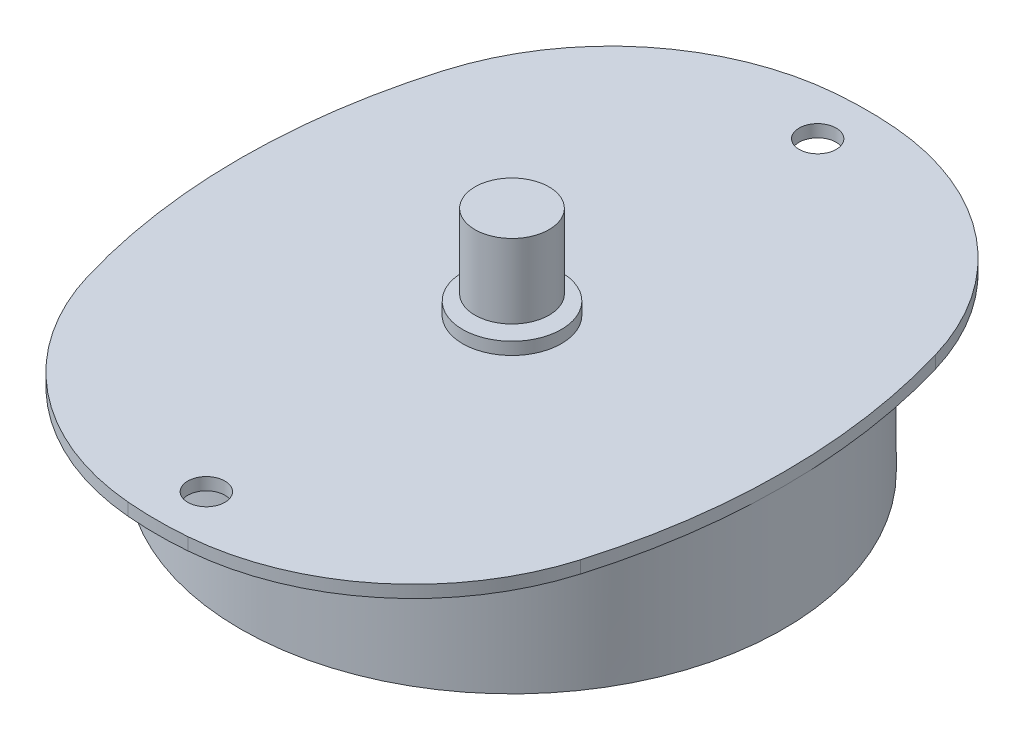
ISO-10303-21;
HEADER;
FILE_DESCRIPTION(('STEP AP214'),'2;1');
FILE_NAME('part.step','',(''),(''),'','','');
FILE_SCHEMA(('AUTOMOTIVE_DESIGN { 1 0 10303 214 1 1 1 1 }'));
ENDSEC;
DATA;
#1=APPLICATION_CONTEXT('core data for automotive mechanical design processes');
#2=APPLICATION_PROTOCOL_DEFINITION('international standard','automotive_design',2000,#1);
#3=PRODUCT_CONTEXT('',#1,'mechanical');
#4=PRODUCT('Part','Part','',(#3));
#5=PRODUCT_RELATED_PRODUCT_CATEGORY('part','',(#4));
#6=PRODUCT_DEFINITION_FORMATION('','',#4);
#7=PRODUCT_DEFINITION_CONTEXT('part definition',#1,'design');
#8=PRODUCT_DEFINITION('design','',#6,#7);
#9=PRODUCT_DEFINITION_SHAPE('','',#8);
#10=(LENGTH_UNIT() NAMED_UNIT(*) SI_UNIT(.MILLI.,.METRE.));
#11=(NAMED_UNIT(*) PLANE_ANGLE_UNIT() SI_UNIT($,.RADIAN.));
#12=(NAMED_UNIT(*) SI_UNIT($,.STERADIAN.) SOLID_ANGLE_UNIT());
#13=UNCERTAINTY_MEASURE_WITH_UNIT(LENGTH_MEASURE(1.E-05),#10,'distance_accuracy_value','');
#14=(GEOMETRIC_REPRESENTATION_CONTEXT(3) GLOBAL_UNCERTAINTY_ASSIGNED_CONTEXT((#13)) GLOBAL_UNIT_ASSIGNED_CONTEXT((#10,
#11,#12)) REPRESENTATION_CONTEXT('',''));
#15=CARTESIAN_POINT('',(0.,0.,0.));
#16=DIRECTION('',(0.,0.,1.));
#17=DIRECTION('',(1.,0.,0.));
#18=AXIS2_PLACEMENT_3D('',#15,#16,#17);
#19=CARTESIAN_POINT('',(0.,11.,0.));
#20=DIRECTION('',(0.,-1.,0.));
#21=DIRECTION('',(0.,0.,-1.));
#22=AXIS2_PLACEMENT_3D('',#19,#20,#21);
#23=CYLINDRICAL_SURFACE('',#22,28.75);
#24=CARTESIAN_POINT('',(0.,10.,0.));
#25=DIRECTION('',(0.,1.,0.));
#26=DIRECTION('',(0.,0.,1.));
#27=AXIS2_PLACEMENT_3D('',#24,#25,#26);
#28=CIRCLE('',#27,28.75);
#29=CARTESIAN_POINT('',(2.425,10.,-28.6475457063952));
#30=VERTEX_POINT('',#29);
#31=CARTESIAN_POINT('',(-2.42500000000004,10.,-28.6475457063952));
#32=VERTEX_POINT('',#31);
#33=EDGE_CURVE('E185',#30,#32,#28,.T.);
#34=ORIENTED_EDGE('',*,*,#33,.T.);
#35=DIRECTION('',(0.,-1.,0.));
#36=VECTOR('',#35,1.);
#37=CARTESIAN_POINT('',(-2.42500000000004,11.,-28.6475457063952));
#38=LINE('',#37,#36);
#39=CARTESIAN_POINT('',(-2.42500000000004,11.,-28.6475457063952));
#40=VERTEX_POINT('',#39);
#41=EDGE_CURVE('E151',#32,#40,#38,.F.);
#42=ORIENTED_EDGE('',*,*,#41,.T.);
#43=CARTESIAN_POINT('',(0.,11.,0.));
#44=DIRECTION('',(0.,1.,0.));
#45=DIRECTION('',(0.,0.,1.));
#46=AXIS2_PLACEMENT_3D('',#43,#44,#45);
#47=CIRCLE('',#46,28.75);
#48=CARTESIAN_POINT('',(2.425,11.,-28.6475457063952));
#49=VERTEX_POINT('',#48);
#50=EDGE_CURVE('E187',#49,#40,#47,.T.);
#51=ORIENTED_EDGE('',*,*,#50,.F.);
#52=DIRECTION('',(0.,-1.,0.));
#53=VECTOR('',#52,1.);
#54=CARTESIAN_POINT('',(2.425,11.,-28.6475457063952));
#55=LINE('',#54,#53);
#56=EDGE_CURVE('E148',#49,#30,#55,.T.);
#57=ORIENTED_EDGE('',*,*,#56,.T.);
#58=EDGE_LOOP('',(#34,#42,#51,#57));
#59=FACE_BOUND('',#58,.T.);
#60=ADVANCED_FACE('F32',(#59),#23,.T.);
#61=CARTESIAN_POINT('',(-2.42500000000004,11.,28.6475457063952));
#62=VERTEX_POINT('',#61);
#63=CARTESIAN_POINT('',(2.42500000000001,11.,28.6475457063952));
#64=VERTEX_POINT('',#63);
#65=EDGE_CURVE('E140',#62,#64,#47,.T.);
#66=ORIENTED_EDGE('',*,*,#65,.F.);
#67=DIRECTION('',(0.,-1.,0.));
#68=VECTOR('',#67,1.);
#69=CARTESIAN_POINT('',(-2.42500000000004,11.,28.6475457063952));
#70=LINE('',#69,#68);
#71=CARTESIAN_POINT('',(-2.42500000000004,10.,28.6475457063952));
#72=VERTEX_POINT('',#71);
#73=EDGE_CURVE('E163',#62,#72,#70,.T.);
#74=ORIENTED_EDGE('',*,*,#73,.T.);
#75=CARTESIAN_POINT('',(2.42500000000001,10.,28.6475457063952));
#76=VERTEX_POINT('',#75);
#77=EDGE_CURVE('E137',#72,#76,#28,.T.);
#78=ORIENTED_EDGE('',*,*,#77,.T.);
#79=DIRECTION('',(0.,-1.,0.));
#80=VECTOR('',#79,1.);
#81=CARTESIAN_POINT('',(2.42500000000001,11.,28.6475457063952));
#82=LINE('',#81,#80);
#83=EDGE_CURVE('E161',#76,#64,#82,.F.);
#84=ORIENTED_EDGE('',*,*,#83,.T.);
#85=EDGE_LOOP('',(#66,#74,#78,#84));
#86=FACE_BOUND('',#85,.T.);
#87=ADVANCED_FACE('F218',(#86),#23,.T.);
#88=CARTESIAN_POINT('',(0.,11.,0.));
#89=DIRECTION('',(0.,1.,0.));
#90=DIRECTION('',(0.,0.,1.));
#91=AXIS2_PLACEMENT_3D('',#88,#89,#90);
#92=PLANE('',#91);
#93=CARTESIAN_POINT('',(0.,11.,0.));
#94=DIRECTION('',(0.,1.,0.));
#95=DIRECTION('',(0.,0.,1.));
#96=AXIS2_PLACEMENT_3D('',#93,#94,#95);
#97=CIRCLE('',#96,4.);
#98=CARTESIAN_POINT('',(0.,11.,4.));
#99=VERTEX_POINT('',#98);
#100=EDGE_CURVE('E247',#99,#99,#97,.T.);
#101=ORIENTED_EDGE('',*,*,#100,.F.);
#102=EDGE_LOOP('',(#101));
#103=FACE_BOUND('',#102,.T.);
#104=CARTESIAN_POINT('',(0.,11.,-24.75));
#105=DIRECTION('',(0.,1.,0.));
#106=DIRECTION('',(0.,0.,1.));
#107=AXIS2_PLACEMENT_3D('',#104,#105,#106);
#108=CIRCLE('',#107,1.5);
#109=CARTESIAN_POINT('',(0.,11.,-23.25));
#110=VERTEX_POINT('',#109);
#111=EDGE_CURVE('E198',#110,#110,#108,.T.);
#112=ORIENTED_EDGE('',*,*,#111,.F.);
#113=EDGE_LOOP('',(#112));
#114=FACE_BOUND('',#113,.T.);
#115=CARTESIAN_POINT('',(0.,11.,24.75));
#116=DIRECTION('',(0.,1.,0.));
#117=DIRECTION('',(0.,0.,1.));
#118=AXIS2_PLACEMENT_3D('',#115,#116,#117);
#119=CIRCLE('',#118,1.5);
#120=CARTESIAN_POINT('',(0.,11.,26.25));
#121=VERTEX_POINT('',#120);
#122=EDGE_CURVE('E190',#121,#121,#119,.T.);
#123=ORIENTED_EDGE('',*,*,#122,.F.);
#124=EDGE_LOOP('',(#123));
#125=FACE_BOUND('',#124,.T.);
#126=ORIENTED_EDGE('',*,*,#50,.T.);
#127=CARTESIAN_POINT('',(-0.738043478260883,11.,-8.7188182584681));
#128=DIRECTION('',(0.,1.,0.));
#129=DIRECTION('',(0.,0.,1.));
#130=AXIS2_PLACEMENT_3D('',#127,#128,#129);
#131=CIRCLE('',#130,20.);
#132=CARTESIAN_POINT('',(-19.9172587486745,11.,-14.3895943615368));
#133=VERTEX_POINT('',#132);
#134=EDGE_CURVE('E159',#40,#133,#131,.T.);
#135=ORIENTED_EDGE('',*,*,#134,.T.);
#136=CARTESIAN_POINT('',(28.75,11.,0.));
#137=DIRECTION('',(0.,-1.,0.));
#138=DIRECTION('',(0.,0.,-1.));
#139=AXIS2_PLACEMENT_3D('',#136,#137,#138);
#140=CIRCLE('',#139,50.75);
#141=CARTESIAN_POINT('',(-19.9172587486745,11.,14.3895943615368));
#142=VERTEX_POINT('',#141);
#143=EDGE_CURVE('E121',#142,#133,#140,.T.);
#144=ORIENTED_EDGE('',*,*,#143,.F.);
#145=CARTESIAN_POINT('',(-0.738043478260883,11.,8.7188182584681));
#146=DIRECTION('',(0.,1.,0.));
#147=DIRECTION('',(0.,0.,1.));
#148=AXIS2_PLACEMENT_3D('',#145,#146,#147);
#149=CIRCLE('',#148,20.);
#150=EDGE_CURVE('E157',#142,#62,#149,.T.);
#151=ORIENTED_EDGE('',*,*,#150,.T.);
#152=ORIENTED_EDGE('',*,*,#65,.T.);
#153=CARTESIAN_POINT('',(0.738043478260873,11.,8.7188182584681));
#154=DIRECTION('',(0.,1.,0.));
#155=DIRECTION('',(0.,0.,1.));
#156=AXIS2_PLACEMENT_3D('',#153,#154,#155);
#157=CIRCLE('',#156,20.);
#158=CARTESIAN_POINT('',(19.9172587486744,11.,14.3895943615368));
#159=VERTEX_POINT('',#158);
#160=EDGE_CURVE('E155',#64,#159,#157,.T.);
#161=ORIENTED_EDGE('',*,*,#160,.T.);
#162=CARTESIAN_POINT('',(-28.75,11.,0.));
#163=DIRECTION('',(0.,-1.,0.));
#164=DIRECTION('',(0.,0.,-1.));
#165=AXIS2_PLACEMENT_3D('',#162,#163,#164);
#166=CIRCLE('',#165,50.75);
#167=CARTESIAN_POINT('',(19.9172587486745,11.,-14.3895943615368));
#168=VERTEX_POINT('',#167);
#169=EDGE_CURVE('E122',#168,#159,#166,.T.);
#170=ORIENTED_EDGE('',*,*,#169,.F.);
#171=CARTESIAN_POINT('',(0.738043478260871,11.,-8.7188182584681));
#172=DIRECTION('',(0.,1.,0.));
#173=DIRECTION('',(0.,0.,1.));
#174=AXIS2_PLACEMENT_3D('',#171,#172,#173);
#175=CIRCLE('',#174,20.);
#176=EDGE_CURVE('E153',#168,#49,#175,.T.);
#177=ORIENTED_EDGE('',*,*,#176,.T.);
#178=EDGE_LOOP('',(#126,#135,#144,#151,#152,#161,#170,#177));
#179=FACE_BOUND('',#178,.T.);
#180=ADVANCED_FACE('F176',(#103,#114,#125,#179),#92,.T.);
#181=CARTESIAN_POINT('',(0.,10.,0.));
#182=DIRECTION('',(0.,1.,0.));
#183=DIRECTION('',(0.,0.,1.));
#184=AXIS2_PLACEMENT_3D('',#181,#182,#183);
#185=PLANE('',#184);
#186=CARTESIAN_POINT('',(0.,10.,24.75));
#187=DIRECTION('',(0.,1.,0.));
#188=DIRECTION('',(0.,0.,1.));
#189=AXIS2_PLACEMENT_3D('',#186,#187,#188);
#190=CIRCLE('',#189,1.5);
#191=CARTESIAN_POINT('',(0.,10.,26.25));
#192=VERTEX_POINT('',#191);
#193=EDGE_CURVE('E188',#192,#192,#190,.T.);
#194=ORIENTED_EDGE('',*,*,#193,.T.);
#195=EDGE_LOOP('',(#194));
#196=FACE_BOUND('',#195,.T.);
#197=ORIENTED_EDGE('',*,*,#77,.F.);
#198=CARTESIAN_POINT('',(-0.738043478260883,10.,8.7188182584681));
#199=DIRECTION('',(0.,1.,0.));
#200=DIRECTION('',(0.,0.,1.));
#201=AXIS2_PLACEMENT_3D('',#198,#199,#200);
#202=CIRCLE('',#201,20.);
#203=CARTESIAN_POINT('',(-19.9172587486745,10.,14.3895943615368));
#204=VERTEX_POINT('',#203);
#205=EDGE_CURVE('E120',#72,#204,#202,.F.);
#206=ORIENTED_EDGE('',*,*,#205,.T.);
#207=CARTESIAN_POINT('',(28.75,10.,0.));
#208=DIRECTION('',(0.,-1.,0.));
#209=DIRECTION('',(0.,0.,-1.));
#210=AXIS2_PLACEMENT_3D('',#207,#208,#209);
#211=CIRCLE('',#210,50.75);
#212=CARTESIAN_POINT('',(-22.,10.,0.));
#213=VERTEX_POINT('',#212);
#214=EDGE_CURVE('E108',#204,#213,#211,.T.);
#215=ORIENTED_EDGE('',*,*,#214,.T.);
#216=CARTESIAN_POINT('',(0.,10.,0.));
#217=DIRECTION('',(0.,1.,0.));
#218=DIRECTION('',(0.,0.,1.));
#219=AXIS2_PLACEMENT_3D('',#216,#217,#218);
#220=CIRCLE('',#219,22.);
#221=CARTESIAN_POINT('',(22.,10.,0.));
#222=VERTEX_POINT('',#221);
#223=EDGE_CURVE('E115',#213,#222,#220,.T.);
#224=ORIENTED_EDGE('',*,*,#223,.T.);
#225=CARTESIAN_POINT('',(-28.75,10.,0.));
#226=DIRECTION('',(0.,-1.,0.));
#227=DIRECTION('',(0.,0.,-1.));
#228=AXIS2_PLACEMENT_3D('',#225,#226,#227);
#229=CIRCLE('',#228,50.75);
#230=CARTESIAN_POINT('',(19.9172587486744,10.,14.3895943615368));
#231=VERTEX_POINT('',#230);
#232=EDGE_CURVE('E245',#222,#231,#229,.T.);
#233=ORIENTED_EDGE('',*,*,#232,.T.);
#234=CARTESIAN_POINT('',(0.738043478260873,10.,8.7188182584681));
#235=DIRECTION('',(0.,1.,0.));
#236=DIRECTION('',(0.,0.,1.));
#237=AXIS2_PLACEMENT_3D('',#234,#235,#236);
#238=CIRCLE('',#237,20.);
#239=EDGE_CURVE('E47',#231,#76,#238,.F.);
#240=ORIENTED_EDGE('',*,*,#239,.T.);
#241=EDGE_LOOP('',(#197,#206,#215,#224,#233,#240));
#242=FACE_BOUND('',#241,.T.);
#243=ADVANCED_FACE('F118',(#196,#242),#185,.F.);
#244=CARTESIAN_POINT('',(0.,10.,-24.75));
#245=DIRECTION('',(0.,1.,0.));
#246=DIRECTION('',(0.,0.,1.));
#247=AXIS2_PLACEMENT_3D('',#244,#245,#246);
#248=CIRCLE('',#247,1.5);
#249=CARTESIAN_POINT('',(0.,10.,-23.25));
#250=VERTEX_POINT('',#249);
#251=EDGE_CURVE('E195',#250,#250,#248,.T.);
#252=ORIENTED_EDGE('',*,*,#251,.T.);
#253=EDGE_LOOP('',(#252));
#254=FACE_BOUND('',#253,.T.);
#255=CARTESIAN_POINT('',(28.75,10.,0.));
#256=DIRECTION('',(0.,1.,0.));
#257=DIRECTION('',(0.,0.,1.));
#258=AXIS2_PLACEMENT_3D('',#255,#256,#257);
#259=CIRCLE('',#258,50.75);
#260=CARTESIAN_POINT('',(-19.9172587486745,10.,-14.3895943615368));
#261=VERTEX_POINT('',#260);
#262=EDGE_CURVE('E104',#261,#213,#259,.T.);
#263=ORIENTED_EDGE('',*,*,#262,.F.);
#264=CARTESIAN_POINT('',(-0.738043478260883,10.,-8.7188182584681));
#265=DIRECTION('',(0.,1.,0.));
#266=DIRECTION('',(0.,0.,1.));
#267=AXIS2_PLACEMENT_3D('',#264,#265,#266);
#268=CIRCLE('',#267,20.);
#269=EDGE_CURVE('E146',#261,#32,#268,.F.);
#270=ORIENTED_EDGE('',*,*,#269,.T.);
#271=ORIENTED_EDGE('',*,*,#33,.F.);
#272=CARTESIAN_POINT('',(0.738043478260871,10.,-8.7188182584681));
#273=DIRECTION('',(0.,1.,0.));
#274=DIRECTION('',(0.,0.,1.));
#275=AXIS2_PLACEMENT_3D('',#272,#273,#274);
#276=CIRCLE('',#275,20.);
#277=CARTESIAN_POINT('',(19.9172587486745,10.,-14.3895943615368));
#278=VERTEX_POINT('',#277);
#279=EDGE_CURVE('E144',#30,#278,#276,.F.);
#280=ORIENTED_EDGE('',*,*,#279,.T.);
#281=EDGE_CURVE('E128',#278,#222,#229,.T.);
#282=ORIENTED_EDGE('',*,*,#281,.T.);
#283=EDGE_CURVE('E125',#222,#213,#220,.T.);
#284=ORIENTED_EDGE('',*,*,#283,.T.);
#285=EDGE_LOOP('',(#263,#270,#271,#280,#282,#284));
#286=FACE_BOUND('',#285,.T.);
#287=ADVANCED_FACE('F126',(#254,#286),#185,.F.);
#288=CARTESIAN_POINT('',(0.,10.,0.));
#289=DIRECTION('',(0.,-1.,0.));
#290=DIRECTION('',(0.,0.,-1.));
#291=AXIS2_PLACEMENT_3D('',#288,#289,#290);
#292=CYLINDRICAL_SURFACE('',#291,22.);
#293=ORIENTED_EDGE('',*,*,#223,.F.);
#294=ORIENTED_EDGE('',*,*,#283,.F.);
#295=EDGE_LOOP('',(#293,#294));
#296=FACE_BOUND('',#295,.T.);
#297=CARTESIAN_POINT('',(0.,0.,0.));
#298=DIRECTION('',(0.,1.,0.));
#299=DIRECTION('',(0.,0.,1.));
#300=AXIS2_PLACEMENT_3D('',#297,#298,#299);
#301=CIRCLE('',#300,22.);
#302=CARTESIAN_POINT('',(0.,0.,22.));
#303=VERTEX_POINT('',#302);
#304=EDGE_CURVE('E131',#303,#303,#301,.T.);
#305=ORIENTED_EDGE('',*,*,#304,.T.);
#306=EDGE_LOOP('',(#305));
#307=FACE_BOUND('',#306,.T.);
#308=ADVANCED_FACE('F133',(#296,#307),#292,.T.);
#309=CARTESIAN_POINT('',(0.,0.,0.));
#310=DIRECTION('',(0.,1.,0.));
#311=DIRECTION('',(0.,0.,1.));
#312=AXIS2_PLACEMENT_3D('',#309,#310,#311);
#313=PLANE('',#312);
#314=ORIENTED_EDGE('',*,*,#304,.F.);
#315=EDGE_LOOP('',(#314));
#316=FACE_BOUND('',#315,.T.);
#317=ADVANCED_FACE('F227',(#316),#313,.F.);
#318=CARTESIAN_POINT('',(0.,10.,24.75));
#319=DIRECTION('',(0.,1.,0.));
#320=DIRECTION('',(0.,0.,1.));
#321=AXIS2_PLACEMENT_3D('',#318,#319,#320);
#322=CYLINDRICAL_SURFACE('',#321,1.5);
#323=ORIENTED_EDGE('',*,*,#193,.F.);
#324=EDGE_LOOP('',(#323));
#325=FACE_BOUND('',#324,.T.);
#326=ORIENTED_EDGE('',*,*,#122,.T.);
#327=EDGE_LOOP('',(#326));
#328=FACE_BOUND('',#327,.T.);
#329=ADVANCED_FACE('F229',(#325,#328),#322,.F.);
#330=CARTESIAN_POINT('',(0.,10.,-24.75));
#331=DIRECTION('',(0.,1.,0.));
#332=DIRECTION('',(0.,0.,1.));
#333=AXIS2_PLACEMENT_3D('',#330,#331,#332);
#334=CYLINDRICAL_SURFACE('',#333,1.5);
#335=ORIENTED_EDGE('',*,*,#251,.F.);
#336=EDGE_LOOP('',(#335));
#337=FACE_BOUND('',#336,.T.);
#338=ORIENTED_EDGE('',*,*,#111,.T.);
#339=EDGE_LOOP('',(#338));
#340=FACE_BOUND('',#339,.T.);
#341=ADVANCED_FACE('F297',(#337,#340),#334,.F.);
#342=CARTESIAN_POINT('',(28.75,11.,0.));
#343=DIRECTION('',(0.,-1.,0.));
#344=DIRECTION('',(0.,0.,-1.));
#345=AXIS2_PLACEMENT_3D('',#342,#343,#344);
#346=CYLINDRICAL_SURFACE('',#345,50.75);
#347=ORIENTED_EDGE('',*,*,#143,.T.);
#348=DIRECTION('',(0.,-1.,0.));
#349=VECTOR('',#348,1.);
#350=CARTESIAN_POINT('',(-19.9172587486745,11.,-14.3895943615368));
#351=LINE('',#350,#349);
#352=EDGE_CURVE('E111',#133,#261,#351,.T.);
#353=ORIENTED_EDGE('',*,*,#352,.T.);
#354=ORIENTED_EDGE('',*,*,#262,.T.);
#355=ORIENTED_EDGE('',*,*,#214,.F.);
#356=DIRECTION('',(0.,-1.,0.));
#357=VECTOR('',#356,1.);
#358=CARTESIAN_POINT('',(-19.9172587486745,11.,14.3895943615368));
#359=LINE('',#358,#357);
#360=EDGE_CURVE('E114',#204,#142,#359,.F.);
#361=ORIENTED_EDGE('',*,*,#360,.T.);
#362=EDGE_LOOP('',(#347,#353,#354,#355,#361));
#363=FACE_BOUND('',#362,.T.);
#364=ADVANCED_FACE('F107',(#363),#346,.T.);
#365=CARTESIAN_POINT('',(-28.75,11.,0.));
#366=DIRECTION('',(0.,-1.,0.));
#367=DIRECTION('',(0.,0.,-1.));
#368=AXIS2_PLACEMENT_3D('',#365,#366,#367);
#369=CYLINDRICAL_SURFACE('',#368,50.75);
#370=ORIENTED_EDGE('',*,*,#169,.T.);
#371=DIRECTION('',(0.,-1.,0.));
#372=VECTOR('',#371,1.);
#373=CARTESIAN_POINT('',(19.9172587486745,11.,14.3895943615368));
#374=LINE('',#373,#372);
#375=EDGE_CURVE('E11',#159,#231,#374,.T.);
#376=ORIENTED_EDGE('',*,*,#375,.T.);
#377=ORIENTED_EDGE('',*,*,#232,.F.);
#378=ORIENTED_EDGE('',*,*,#281,.F.);
#379=DIRECTION('',(0.,-1.,0.));
#380=VECTOR('',#379,1.);
#381=CARTESIAN_POINT('',(19.9172587486745,11.,-14.3895943615368));
#382=LINE('',#381,#380);
#383=EDGE_CURVE('E40',#278,#168,#382,.F.);
#384=ORIENTED_EDGE('',*,*,#383,.T.);
#385=EDGE_LOOP('',(#370,#376,#377,#378,#384));
#386=FACE_BOUND('',#385,.T.);
#387=ADVANCED_FACE('F171',(#386),#369,.T.);
#388=CARTESIAN_POINT('',(-0.738043478260883,11.,-8.7188182584681));
#389=DIRECTION('',(0.,-1.,0.));
#390=DIRECTION('',(0.,0.,-1.));
#391=AXIS2_PLACEMENT_3D('',#388,#389,#390);
#392=CYLINDRICAL_SURFACE('',#391,20.);
#393=ORIENTED_EDGE('',*,*,#134,.F.);
#394=ORIENTED_EDGE('',*,*,#41,.F.);
#395=ORIENTED_EDGE('',*,*,#269,.F.);
#396=ORIENTED_EDGE('',*,*,#352,.F.);
#397=EDGE_LOOP('',(#393,#394,#395,#396));
#398=FACE_BOUND('',#397,.T.);
#399=ADVANCED_FACE('F204',(#398),#392,.T.);
#400=CARTESIAN_POINT('',(-0.738043478260883,11.,8.7188182584681));
#401=DIRECTION('',(0.,-1.,0.));
#402=DIRECTION('',(0.,0.,-1.));
#403=AXIS2_PLACEMENT_3D('',#400,#401,#402);
#404=CYLINDRICAL_SURFACE('',#403,20.);
#405=ORIENTED_EDGE('',*,*,#150,.F.);
#406=ORIENTED_EDGE('',*,*,#360,.F.);
#407=ORIENTED_EDGE('',*,*,#205,.F.);
#408=ORIENTED_EDGE('',*,*,#73,.F.);
#409=EDGE_LOOP('',(#405,#406,#407,#408));
#410=FACE_BOUND('',#409,.T.);
#411=ADVANCED_FACE('F206',(#410),#404,.T.);
#412=CARTESIAN_POINT('',(0.738043478260873,11.,8.7188182584681));
#413=DIRECTION('',(0.,-1.,0.));
#414=DIRECTION('',(0.,0.,-1.));
#415=AXIS2_PLACEMENT_3D('',#412,#413,#414);
#416=CYLINDRICAL_SURFACE('',#415,20.);
#417=ORIENTED_EDGE('',*,*,#160,.F.);
#418=ORIENTED_EDGE('',*,*,#83,.F.);
#419=ORIENTED_EDGE('',*,*,#239,.F.);
#420=ORIENTED_EDGE('',*,*,#375,.F.);
#421=EDGE_LOOP('',(#417,#418,#419,#420));
#422=FACE_BOUND('',#421,.T.);
#423=ADVANCED_FACE('F212',(#422),#416,.T.);
#424=CARTESIAN_POINT('',(0.738043478260871,11.,-8.7188182584681));
#425=DIRECTION('',(0.,-1.,0.));
#426=DIRECTION('',(0.,0.,-1.));
#427=AXIS2_PLACEMENT_3D('',#424,#425,#426);
#428=CYLINDRICAL_SURFACE('',#427,20.);
#429=ORIENTED_EDGE('',*,*,#176,.F.);
#430=ORIENTED_EDGE('',*,*,#383,.F.);
#431=ORIENTED_EDGE('',*,*,#279,.F.);
#432=ORIENTED_EDGE('',*,*,#56,.F.);
#433=EDGE_LOOP('',(#429,#430,#431,#432));
#434=FACE_BOUND('',#433,.T.);
#435=ADVANCED_FACE('F34',(#434),#428,.T.);
#436=CARTESIAN_POINT('',(0.,12.,0.));
#437=DIRECTION('',(0.,-1.,0.));
#438=DIRECTION('',(0.,0.,-1.));
#439=AXIS2_PLACEMENT_3D('',#436,#437,#438);
#440=CYLINDRICAL_SURFACE('',#439,4.);
#441=CARTESIAN_POINT('',(0.,12.,0.));
#442=DIRECTION('',(0.,1.,0.));
#443=DIRECTION('',(0.,0.,1.));
#444=AXIS2_PLACEMENT_3D('',#441,#442,#443);
#445=CIRCLE('',#444,4.);
#446=CARTESIAN_POINT('',(0.,12.,4.));
#447=VERTEX_POINT('',#446);
#448=EDGE_CURVE('E250',#447,#447,#445,.T.);
#449=ORIENTED_EDGE('',*,*,#448,.F.);
#450=EDGE_LOOP('',(#449));
#451=FACE_BOUND('',#450,.T.);
#452=ORIENTED_EDGE('',*,*,#100,.T.);
#453=EDGE_LOOP('',(#452));
#454=FACE_BOUND('',#453,.T.);
#455=ADVANCED_FACE('F290',(#451,#454),#440,.T.);
#456=CARTESIAN_POINT('',(0.,12.,0.));
#457=DIRECTION('',(0.,1.,0.));
#458=DIRECTION('',(0.,0.,1.));
#459=AXIS2_PLACEMENT_3D('',#456,#457,#458);
#460=PLANE('',#459);
#461=CARTESIAN_POINT('',(0.,12.,0.));
#462=DIRECTION('',(0.,1.,0.));
#463=DIRECTION('',(0.,0.,1.));
#464=AXIS2_PLACEMENT_3D('',#461,#462,#463);
#465=CIRCLE('',#464,1.);
#466=CARTESIAN_POINT('',(0.,12.,1.));
#467=VERTEX_POINT('',#466);
#468=EDGE_CURVE('E254',#467,#467,#465,.T.);
#469=ORIENTED_EDGE('',*,*,#468,.F.);
#470=EDGE_LOOP('',(#469));
#471=FACE_BOUND('',#470,.T.);
#472=ORIENTED_EDGE('',*,*,#448,.T.);
#473=EDGE_LOOP('',(#472));
#474=FACE_BOUND('',#473,.T.);
#475=ADVANCED_FACE('F286',(#471,#474),#460,.T.);
#476=CARTESIAN_POINT('',(0.,12.5,0.));
#477=DIRECTION('',(0.,-1.,0.));
#478=DIRECTION('',(0.,0.,-1.));
#479=AXIS2_PLACEMENT_3D('',#476,#477,#478);
#480=CYLINDRICAL_SURFACE('',#479,1.);
#481=CARTESIAN_POINT('',(0.,12.5,0.));
#482=DIRECTION('',(0.,1.,0.));
#483=DIRECTION('',(0.,0.,1.));
#484=AXIS2_PLACEMENT_3D('',#481,#482,#483);
#485=CIRCLE('',#484,1.);
#486=CARTESIAN_POINT('',(0.,12.5,1.));
#487=VERTEX_POINT('',#486);
#488=EDGE_CURVE('E251',#487,#487,#485,.T.);
#489=ORIENTED_EDGE('',*,*,#488,.F.);
#490=EDGE_LOOP('',(#489));
#491=FACE_BOUND('',#490,.T.);
#492=ORIENTED_EDGE('',*,*,#468,.T.);
#493=EDGE_LOOP('',(#492));
#494=FACE_BOUND('',#493,.T.);
#495=ADVANCED_FACE('F271',(#491,#494),#480,.T.);
#496=CARTESIAN_POINT('',(0.,18.5,0.));
#497=DIRECTION('',(0.,-1.,0.));
#498=DIRECTION('',(0.,0.,-1.));
#499=AXIS2_PLACEMENT_3D('',#496,#497,#498);
#500=CYLINDRICAL_SURFACE('',#499,3.);
#501=CARTESIAN_POINT('',(0.,18.5,0.));
#502=DIRECTION('',(0.,1.,0.));
#503=DIRECTION('',(0.,0.,1.));
#504=AXIS2_PLACEMENT_3D('',#501,#502,#503);
#505=CIRCLE('',#504,3.);
#506=CARTESIAN_POINT('',(0.,18.5,3.));
#507=VERTEX_POINT('',#506);
#508=EDGE_CURVE('E257',#507,#507,#505,.T.);
#509=ORIENTED_EDGE('',*,*,#508,.F.);
#510=EDGE_LOOP('',(#509));
#511=FACE_BOUND('',#510,.T.);
#512=CARTESIAN_POINT('',(0.,12.5,0.));
#513=DIRECTION('',(0.,1.,0.));
#514=DIRECTION('',(0.,0.,1.));
#515=AXIS2_PLACEMENT_3D('',#512,#513,#514);
#516=CIRCLE('',#515,3.);
#517=CARTESIAN_POINT('',(0.,12.5,3.));
#518=VERTEX_POINT('',#517);
#519=EDGE_CURVE('E260',#518,#518,#516,.T.);
#520=ORIENTED_EDGE('',*,*,#519,.T.);
#521=EDGE_LOOP('',(#520));
#522=FACE_BOUND('',#521,.T.);
#523=ADVANCED_FACE('F268',(#511,#522),#500,.T.);
#524=CARTESIAN_POINT('',(0.,18.5,0.));
#525=DIRECTION('',(0.,1.,0.));
#526=DIRECTION('',(0.,0.,1.));
#527=AXIS2_PLACEMENT_3D('',#524,#525,#526);
#528=PLANE('',#527);
#529=ORIENTED_EDGE('',*,*,#508,.T.);
#530=EDGE_LOOP('',(#529));
#531=FACE_BOUND('',#530,.T.);
#532=ADVANCED_FACE('F266',(#531),#528,.T.);
#533=CARTESIAN_POINT('',(0.,12.5,0.));
#534=DIRECTION('',(0.,1.,0.));
#535=DIRECTION('',(0.,0.,1.));
#536=AXIS2_PLACEMENT_3D('',#533,#534,#535);
#537=PLANE('',#536);
#538=ORIENTED_EDGE('',*,*,#488,.T.);
#539=EDGE_LOOP('',(#538));
#540=FACE_BOUND('',#539,.T.);
#541=ORIENTED_EDGE('',*,*,#519,.F.);
#542=EDGE_LOOP('',(#541));
#543=FACE_BOUND('',#542,.T.);
#544=ADVANCED_FACE('F275',(#540,#543),#537,.F.);
#545=CLOSED_SHELL('',(#60,#87,#180,#243,#287,#308,#317,#329,#341,#364,#387,#399,#411,#423,#435,
#455,#475,#495,#523,#532,#544));
#546=MANIFOLD_SOLID_BREP('B2',#545);
#547=ADVANCED_BREP_SHAPE_REPRESENTATION('',(#18,#546),#14);
#548=SHAPE_DEFINITION_REPRESENTATION(#9,#547);
ENDSEC;
END-ISO-10303-21;
